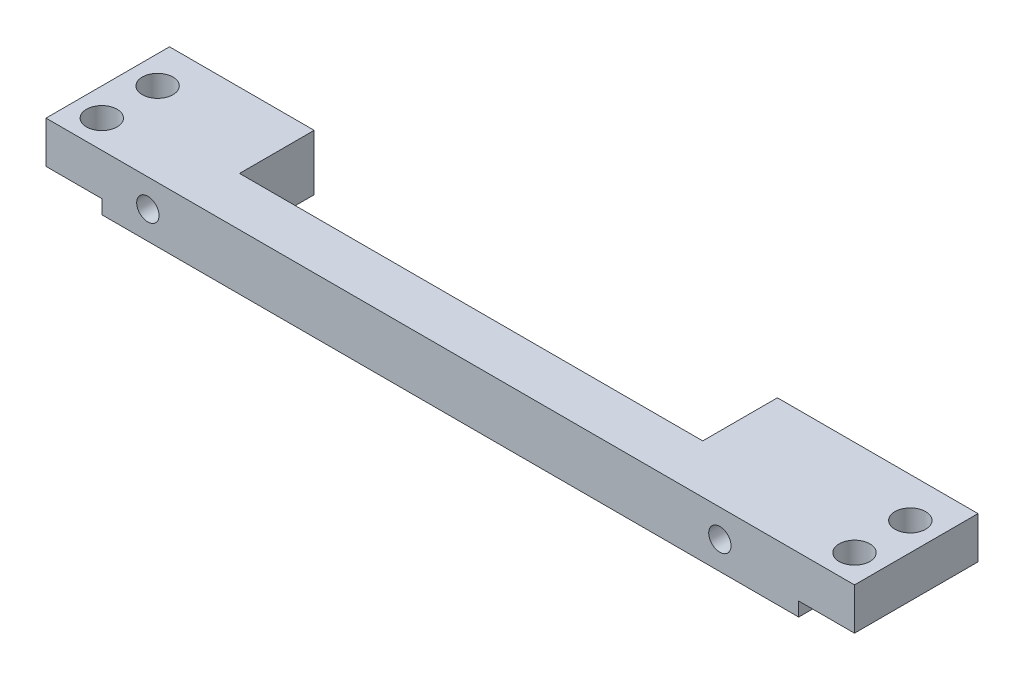
ISO-10303-21;
HEADER;
FILE_DESCRIPTION(('STEP AP214'),'2;1');
FILE_NAME('part.step','',(''),(''),'','','');
FILE_SCHEMA(('AUTOMOTIVE_DESIGN { 1 0 10303 214 1 1 1 1 }'));
ENDSEC;
DATA;
#1=APPLICATION_CONTEXT('core data for automotive mechanical design processes');
#2=APPLICATION_PROTOCOL_DEFINITION('international standard','automotive_design',2000,#1);
#3=PRODUCT_CONTEXT('',#1,'mechanical');
#4=PRODUCT('Part','Part','',(#3));
#5=PRODUCT_RELATED_PRODUCT_CATEGORY('part','',(#4));
#6=PRODUCT_DEFINITION_FORMATION('','',#4);
#7=PRODUCT_DEFINITION_CONTEXT('part definition',#1,'design');
#8=PRODUCT_DEFINITION('design','',#6,#7);
#9=PRODUCT_DEFINITION_SHAPE('','',#8);
#10=(LENGTH_UNIT() NAMED_UNIT(*) SI_UNIT(.MILLI.,.METRE.));
#11=(NAMED_UNIT(*) PLANE_ANGLE_UNIT() SI_UNIT($,.RADIAN.));
#12=(NAMED_UNIT(*) SI_UNIT($,.STERADIAN.) SOLID_ANGLE_UNIT());
#13=UNCERTAINTY_MEASURE_WITH_UNIT(LENGTH_MEASURE(1.E-05),#10,'distance_accuracy_value','');
#14=(GEOMETRIC_REPRESENTATION_CONTEXT(3) GLOBAL_UNCERTAINTY_ASSIGNED_CONTEXT((#13)) GLOBAL_UNIT_ASSIGNED_CONTEXT((#10,
#11,#12)) REPRESENTATION_CONTEXT('',''));
#15=CARTESIAN_POINT('',(0.,0.,0.));
#16=DIRECTION('',(0.,0.,1.));
#17=DIRECTION('',(1.,0.,0.));
#18=AXIS2_PLACEMENT_3D('',#15,#16,#17);
#19=CARTESIAN_POINT('',(0.,0.,2.248090434488));
#20=DIRECTION('',(0.,0.,-1.));
#21=DIRECTION('',(-1.,0.,0.));
#22=AXIS2_PLACEMENT_3D('',#19,#20,#21);
#23=PLANE('',#22);
#24=DIRECTION('',(0.,1.,0.));
#25=VECTOR('',#24,1.);
#26=CARTESIAN_POINT('',(6.07,0.,2.248090434488));
#27=LINE('',#26,#25);
#28=CARTESIAN_POINT('',(6.07,41.68,2.248090434488));
#29=VERTEX_POINT('',#28);
#30=CARTESIAN_POINT('',(6.07,45.68,2.248090434488));
#31=VERTEX_POINT('',#30);
#32=EDGE_CURVE('E11',#29,#31,#27,.T.);
#33=ORIENTED_EDGE('',*,*,#32,.F.);
#34=DIRECTION('',(1.,0.,0.));
#35=VECTOR('',#34,1.);
#36=CARTESIAN_POINT('',(-4.3,41.68,2.248090434488));
#37=LINE('',#36,#35);
#38=CARTESIAN_POINT('',(-0.3,41.68,2.248090434488));
#39=VERTEX_POINT('',#38);
#40=EDGE_CURVE('E165',#39,#29,#37,.T.);
#41=ORIENTED_EDGE('',*,*,#40,.F.);
#42=DIRECTION('',(0.,1.,0.));
#43=VECTOR('',#42,1.);
#44=CARTESIAN_POINT('',(-0.3,41.68,2.248090434488));
#45=LINE('',#44,#43);
#46=CARTESIAN_POINT('',(-0.3,42.68,2.248090434488));
#47=VERTEX_POINT('',#46);
#48=EDGE_CURVE('E223',#39,#47,#45,.T.);
#49=ORIENTED_EDGE('',*,*,#48,.T.);
#50=DIRECTION('',(-1.,0.,0.));
#51=VECTOR('',#50,1.);
#52=CARTESIAN_POINT('',(-4.3,42.68,2.248090434488));
#53=LINE('',#52,#51);
#54=CARTESIAN_POINT('',(-4.3,42.68,2.248090434488));
#55=VERTEX_POINT('',#54);
#56=EDGE_CURVE('E227',#47,#55,#53,.T.);
#57=ORIENTED_EDGE('',*,*,#56,.T.);
#58=DIRECTION('',(0.,-1.,0.));
#59=VECTOR('',#58,1.);
#60=CARTESIAN_POINT('',(-4.3,41.68,2.248090434488));
#61=LINE('',#60,#59);
#62=CARTESIAN_POINT('',(-4.3,45.68,2.248090434488));
#63=VERTEX_POINT('',#62);
#64=EDGE_CURVE('E242',#63,#55,#61,.T.);
#65=ORIENTED_EDGE('',*,*,#64,.F.);
#66=DIRECTION('',(-1.,0.,0.));
#67=VECTOR('',#66,1.);
#68=CARTESIAN_POINT('',(-4.3,45.68,2.248090434488));
#69=LINE('',#68,#67);
#70=EDGE_CURVE('E273',#31,#63,#69,.T.);
#71=ORIENTED_EDGE('',*,*,#70,.F.);
#72=EDGE_LOOP('',(#33,#41,#49,#57,#65,#71));
#73=FACE_BOUND('',#72,.T.);
#74=CARTESIAN_POINT('',(3.,43.68,2.248090434488));
#75=DIRECTION('',(0.,0.,1.));
#76=DIRECTION('',(1.,0.,0.));
#77=AXIS2_PLACEMENT_3D('',#74,#75,#76);
#78=CIRCLE('',#77,0.8);
#79=CARTESIAN_POINT('',(3.8,43.68,2.248090434488));
#80=VERTEX_POINT('',#79);
#81=EDGE_CURVE('E186',#80,#80,#78,.T.);
#82=ORIENTED_EDGE('',*,*,#81,.T.);
#83=EDGE_LOOP('',(#82));
#84=FACE_BOUND('',#83,.T.);
#85=ADVANCED_FACE('F47',(#73,#84),#23,.T.);
#86=CARTESIAN_POINT('',(-4.3,41.68,11.1));
#87=DIRECTION('',(1.,0.,0.));
#88=DIRECTION('',(0.,0.,-1.));
#89=AXIS2_PLACEMENT_3D('',#86,#87,#88);
#90=PLANE('',#89);
#91=ORIENTED_EDGE('',*,*,#64,.T.);
#92=DIRECTION('',(0.,0.,1.));
#93=VECTOR('',#92,1.);
#94=CARTESIAN_POINT('',(-4.3,42.68,2.248090434488));
#95=LINE('',#94,#93);
#96=CARTESIAN_POINT('',(-4.3,42.68,11.1));
#97=VERTEX_POINT('',#96);
#98=EDGE_CURVE('E238',#55,#97,#95,.T.);
#99=ORIENTED_EDGE('',*,*,#98,.T.);
#100=DIRECTION('',(0.,-1.,0.));
#101=VECTOR('',#100,1.);
#102=CARTESIAN_POINT('',(-4.3,41.68,11.1));
#103=LINE('',#102,#101);
#104=CARTESIAN_POINT('',(-4.3,45.68,11.1));
#105=VERTEX_POINT('',#104);
#106=EDGE_CURVE('E248',#105,#97,#103,.T.);
#107=ORIENTED_EDGE('',*,*,#106,.F.);
#108=DIRECTION('',(0.,0.,-1.));
#109=VECTOR('',#108,1.);
#110=CARTESIAN_POINT('',(-4.3,45.68,11.1));
#111=LINE('',#110,#109);
#112=EDGE_CURVE('E263',#105,#63,#111,.T.);
#113=ORIENTED_EDGE('',*,*,#112,.T.);
#114=EDGE_LOOP('',(#91,#99,#107,#113));
#115=FACE_BOUND('',#114,.T.);
#116=ADVANCED_FACE('F49',(#115),#90,.F.);
#117=CARTESIAN_POINT('',(-4.3,41.68,11.1));
#118=DIRECTION('',(0.,1.,0.));
#119=DIRECTION('',(0.,0.,1.));
#120=AXIS2_PLACEMENT_3D('',#117,#118,#119);
#121=PLANE('',#120);
#122=ORIENTED_EDGE('',*,*,#40,.T.);
#123=DIRECTION('',(0.,0.,1.));
#124=VECTOR('',#123,1.);
#125=CARTESIAN_POINT('',(6.07,41.68,0.9));
#126=LINE('',#125,#124);
#127=CARTESIAN_POINT('',(6.07,41.68,7.6));
#128=VERTEX_POINT('',#127);
#129=EDGE_CURVE('E142',#29,#128,#126,.T.);
#130=ORIENTED_EDGE('',*,*,#129,.T.);
#131=DIRECTION('',(1.,0.,0.));
#132=VECTOR('',#131,1.);
#133=CARTESIAN_POINT('',(6.07,41.68,7.6));
#134=LINE('',#133,#132);
#135=CARTESIAN_POINT('',(39.273,41.68,7.6));
#136=VERTEX_POINT('',#135);
#137=EDGE_CURVE('E154',#128,#136,#134,.T.);
#138=ORIENTED_EDGE('',*,*,#137,.T.);
#139=DIRECTION('',(0.,0.,-1.));
#140=VECTOR('',#139,1.);
#141=CARTESIAN_POINT('',(39.273,41.68,0.9));
#142=LINE('',#141,#140);
#143=CARTESIAN_POINT('',(39.273,41.68,2.248090434488));
#144=VERTEX_POINT('',#143);
#145=EDGE_CURVE('E151',#136,#144,#142,.T.);
#146=ORIENTED_EDGE('',*,*,#145,.T.);
#147=CARTESIAN_POINT('',(49.65,41.68,2.248090434488));
#148=VERTEX_POINT('',#147);
#149=EDGE_CURVE('E267',#144,#148,#37,.T.);
#150=ORIENTED_EDGE('',*,*,#149,.T.);
#151=DIRECTION('',(0.,0.,1.));
#152=VECTOR('',#151,1.);
#153=CARTESIAN_POINT('',(49.65,41.68,2.248090434488));
#154=LINE('',#153,#152);
#155=CARTESIAN_POINT('',(49.65,41.68,11.1));
#156=VERTEX_POINT('',#155);
#157=EDGE_CURVE('E209',#148,#156,#154,.T.);
#158=ORIENTED_EDGE('',*,*,#157,.T.);
#159=DIRECTION('',(1.,0.,0.));
#160=VECTOR('',#159,1.);
#161=CARTESIAN_POINT('',(-4.3,41.68,11.1));
#162=LINE('',#161,#160);
#163=CARTESIAN_POINT('',(-0.3,41.68,11.1));
#164=VERTEX_POINT('',#163);
#165=EDGE_CURVE('E252',#164,#156,#162,.T.);
#166=ORIENTED_EDGE('',*,*,#165,.F.);
#167=DIRECTION('',(0.,0.,1.));
#168=VECTOR('',#167,1.);
#169=CARTESIAN_POINT('',(-0.3,41.68,2.248090434488));
#170=LINE('',#169,#168);
#171=EDGE_CURVE('E232',#39,#164,#170,.T.);
#172=ORIENTED_EDGE('',*,*,#171,.F.);
#173=EDGE_LOOP('',(#122,#130,#138,#146,#150,#158,#166,#172));
#174=FACE_BOUND('',#173,.T.);
#175=ADVANCED_FACE('F162',(#174),#121,.F.);
#176=CARTESIAN_POINT('',(53.65,41.68,11.1));
#177=DIRECTION('',(-1.,0.,0.));
#178=DIRECTION('',(0.,0.,1.));
#179=AXIS2_PLACEMENT_3D('',#176,#177,#178);
#180=PLANE('',#179);
#181=DIRECTION('',(0.,1.,0.));
#182=VECTOR('',#181,1.);
#183=CARTESIAN_POINT('',(53.65,41.68,11.1));
#184=LINE('',#183,#182);
#185=CARTESIAN_POINT('',(53.65,42.68,11.1));
#186=VERTEX_POINT('',#185);
#187=CARTESIAN_POINT('',(53.65,45.68,11.1));
#188=VERTEX_POINT('',#187);
#189=EDGE_CURVE('E257',#186,#188,#184,.T.);
#190=ORIENTED_EDGE('',*,*,#189,.F.);
#191=DIRECTION('',(0.,0.,1.));
#192=VECTOR('',#191,1.);
#193=CARTESIAN_POINT('',(53.65,42.68,2.248090434488));
#194=LINE('',#193,#192);
#195=CARTESIAN_POINT('',(53.65,42.68,2.248090434488));
#196=VERTEX_POINT('',#195);
#197=EDGE_CURVE('E218',#196,#186,#194,.T.);
#198=ORIENTED_EDGE('',*,*,#197,.F.);
#199=DIRECTION('',(0.,1.,0.));
#200=VECTOR('',#199,1.);
#201=CARTESIAN_POINT('',(53.65,41.68,2.248090434488));
#202=LINE('',#201,#200);
#203=CARTESIAN_POINT('',(53.65,45.68,2.248090434488));
#204=VERTEX_POINT('',#203);
#205=EDGE_CURVE('E270',#196,#204,#202,.T.);
#206=ORIENTED_EDGE('',*,*,#205,.T.);
#207=DIRECTION('',(0.,0.,-1.));
#208=VECTOR('',#207,1.);
#209=CARTESIAN_POINT('',(53.65,45.68,11.1));
#210=LINE('',#209,#208);
#211=EDGE_CURVE('E280',#188,#204,#210,.T.);
#212=ORIENTED_EDGE('',*,*,#211,.F.);
#213=EDGE_LOOP('',(#190,#198,#206,#212));
#214=FACE_BOUND('',#213,.T.);
#215=ADVANCED_FACE('F365',(#214),#180,.F.);
#216=CARTESIAN_POINT('',(-4.3,45.68,11.1));
#217=DIRECTION('',(0.,-1.,0.));
#218=DIRECTION('',(0.,0.,-1.));
#219=AXIS2_PLACEMENT_3D('',#216,#217,#218);
#220=PLANE('',#219);
#221=CARTESIAN_POINT('',(-2.3,45.68,9.1));
#222=DIRECTION('',(0.,1.,0.));
#223=DIRECTION('',(0.,0.,1.));
#224=AXIS2_PLACEMENT_3D('',#221,#222,#223);
#225=CIRCLE('',#224,1.1);
#226=CARTESIAN_POINT('',(-2.3,45.68,10.2));
#227=VERTEX_POINT('',#226);
#228=EDGE_CURVE('E410',#227,#227,#225,.T.);
#229=ORIENTED_EDGE('',*,*,#228,.F.);
#230=EDGE_LOOP('',(#229));
#231=FACE_BOUND('',#230,.T.);
#232=CARTESIAN_POINT('',(51.65,45.68,5.1));
#233=DIRECTION('',(0.,1.,0.));
#234=DIRECTION('',(0.,0.,1.));
#235=AXIS2_PLACEMENT_3D('',#232,#233,#234);
#236=CIRCLE('',#235,1.1);
#237=CARTESIAN_POINT('',(51.65,45.68,6.2));
#238=VERTEX_POINT('',#237);
#239=EDGE_CURVE('E403',#238,#238,#236,.T.);
#240=ORIENTED_EDGE('',*,*,#239,.F.);
#241=EDGE_LOOP('',(#240));
#242=FACE_BOUND('',#241,.T.);
#243=CARTESIAN_POINT('',(51.65,45.68,9.1));
#244=DIRECTION('',(0.,1.,0.));
#245=DIRECTION('',(0.,0.,1.));
#246=AXIS2_PLACEMENT_3D('',#243,#244,#245);
#247=CIRCLE('',#246,1.1);
#248=CARTESIAN_POINT('',(51.65,45.68,10.2));
#249=VERTEX_POINT('',#248);
#250=EDGE_CURVE('E411',#249,#249,#247,.T.);
#251=ORIENTED_EDGE('',*,*,#250,.F.);
#252=EDGE_LOOP('',(#251));
#253=FACE_BOUND('',#252,.T.);
#254=CARTESIAN_POINT('',(-2.3,45.68,5.1));
#255=DIRECTION('',(0.,1.,0.));
#256=DIRECTION('',(0.,0.,1.));
#257=AXIS2_PLACEMENT_3D('',#254,#255,#256);
#258=CIRCLE('',#257,1.1);
#259=CARTESIAN_POINT('',(-2.3,45.68,6.2));
#260=VERTEX_POINT('',#259);
#261=EDGE_CURVE('E174',#260,#260,#258,.T.);
#262=ORIENTED_EDGE('',*,*,#261,.F.);
#263=EDGE_LOOP('',(#262));
#264=FACE_BOUND('',#263,.T.);
#265=DIRECTION('',(1.,0.,0.));
#266=VECTOR('',#265,1.);
#267=CARTESIAN_POINT('',(6.07,45.68,7.6));
#268=LINE('',#267,#266);
#269=CARTESIAN_POINT('',(6.07,45.68,7.6));
#270=VERTEX_POINT('',#269);
#271=CARTESIAN_POINT('',(39.273,45.68,7.6));
#272=VERTEX_POINT('',#271);
#273=EDGE_CURVE('E171',#270,#272,#268,.T.);
#274=ORIENTED_EDGE('',*,*,#273,.F.);
#275=DIRECTION('',(0.,0.,1.));
#276=VECTOR('',#275,1.);
#277=CARTESIAN_POINT('',(6.07,45.68,0.9));
#278=LINE('',#277,#276);
#279=EDGE_CURVE('E145',#31,#270,#278,.T.);
#280=ORIENTED_EDGE('',*,*,#279,.F.);
#281=ORIENTED_EDGE('',*,*,#70,.T.);
#282=ORIENTED_EDGE('',*,*,#112,.F.);
#283=DIRECTION('',(-1.,0.,0.));
#284=VECTOR('',#283,1.);
#285=CARTESIAN_POINT('',(-4.3,45.68,11.1));
#286=LINE('',#285,#284);
#287=EDGE_CURVE('E260',#188,#105,#286,.T.);
#288=ORIENTED_EDGE('',*,*,#287,.F.);
#289=ORIENTED_EDGE('',*,*,#211,.T.);
#290=CARTESIAN_POINT('',(39.273,45.68,2.248090434488));
#291=VERTEX_POINT('',#290);
#292=EDGE_CURVE('E253',#204,#291,#69,.T.);
#293=ORIENTED_EDGE('',*,*,#292,.T.);
#294=DIRECTION('',(0.,0.,-1.));
#295=VECTOR('',#294,1.);
#296=CARTESIAN_POINT('',(39.273,45.68,0.9));
#297=LINE('',#296,#295);
#298=EDGE_CURVE('E65',#272,#291,#297,.T.);
#299=ORIENTED_EDGE('',*,*,#298,.F.);
#300=EDGE_LOOP('',(#274,#280,#281,#282,#288,#289,#293,#299));
#301=FACE_BOUND('',#300,.T.);
#302=ADVANCED_FACE('F338',(#231,#242,#253,#264,#301),#220,.F.);
#303=CARTESIAN_POINT('',(0.,0.,11.1));
#304=DIRECTION('',(0.,0.,-1.));
#305=DIRECTION('',(-1.,0.,0.));
#306=AXIS2_PLACEMENT_3D('',#303,#304,#305);
#307=PLANE('',#306);
#308=CARTESIAN_POINT('',(3.,43.68,11.1));
#309=DIRECTION('',(0.,0.,1.));
#310=DIRECTION('',(1.,0.,0.));
#311=AXIS2_PLACEMENT_3D('',#308,#309,#310);
#312=CIRCLE('',#311,0.8);
#313=CARTESIAN_POINT('',(3.8,43.68,11.1));
#314=VERTEX_POINT('',#313);
#315=EDGE_CURVE('E191',#314,#314,#312,.T.);
#316=ORIENTED_EDGE('',*,*,#315,.F.);
#317=EDGE_LOOP('',(#316));
#318=FACE_BOUND('',#317,.T.);
#319=CARTESIAN_POINT('',(44.,43.68,11.1));
#320=DIRECTION('',(0.,0.,1.));
#321=DIRECTION('',(1.,0.,0.));
#322=AXIS2_PLACEMENT_3D('',#319,#320,#321);
#323=CIRCLE('',#322,0.800000000000002);
#324=CARTESIAN_POINT('',(44.8,43.68,11.1));
#325=VERTEX_POINT('',#324);
#326=EDGE_CURVE('E195',#325,#325,#323,.T.);
#327=ORIENTED_EDGE('',*,*,#326,.F.);
#328=EDGE_LOOP('',(#327));
#329=FACE_BOUND('',#328,.T.);
#330=ORIENTED_EDGE('',*,*,#165,.T.);
#331=DIRECTION('',(0.,-1.,0.));
#332=VECTOR('',#331,1.);
#333=CARTESIAN_POINT('',(49.65,41.68,11.1));
#334=LINE('',#333,#332);
#335=CARTESIAN_POINT('',(49.65,42.68,11.1));
#336=VERTEX_POINT('',#335);
#337=EDGE_CURVE('E190',#336,#156,#334,.T.);
#338=ORIENTED_EDGE('',*,*,#337,.F.);
#339=DIRECTION('',(-1.,0.,0.));
#340=VECTOR('',#339,1.);
#341=CARTESIAN_POINT('',(49.65,42.68,11.1));
#342=LINE('',#341,#340);
#343=EDGE_CURVE('E205',#186,#336,#342,.T.);
#344=ORIENTED_EDGE('',*,*,#343,.F.);
#345=ORIENTED_EDGE('',*,*,#189,.T.);
#346=ORIENTED_EDGE('',*,*,#287,.T.);
#347=ORIENTED_EDGE('',*,*,#106,.T.);
#348=DIRECTION('',(-1.,0.,0.));
#349=VECTOR('',#348,1.);
#350=CARTESIAN_POINT('',(-4.3,42.68,11.1));
#351=LINE('',#350,#349);
#352=CARTESIAN_POINT('',(-0.3,42.68,11.1));
#353=VERTEX_POINT('',#352);
#354=EDGE_CURVE('E228',#353,#97,#351,.T.);
#355=ORIENTED_EDGE('',*,*,#354,.F.);
#356=DIRECTION('',(0.,1.,0.));
#357=VECTOR('',#356,1.);
#358=CARTESIAN_POINT('',(-0.3,41.68,11.1));
#359=LINE('',#358,#357);
#360=EDGE_CURVE('E217',#164,#353,#359,.T.);
#361=ORIENTED_EDGE('',*,*,#360,.F.);
#362=EDGE_LOOP('',(#330,#338,#344,#345,#346,#347,#355,#361));
#363=FACE_BOUND('',#362,.T.);
#364=ADVANCED_FACE('F331',(#318,#329,#363),#307,.F.);
#365=DIRECTION('',(0.,-1.,0.));
#366=VECTOR('',#365,1.);
#367=CARTESIAN_POINT('',(39.273,0.,2.248090434488));
#368=LINE('',#367,#366);
#369=EDGE_CURVE('E57',#291,#144,#368,.T.);
#370=ORIENTED_EDGE('',*,*,#369,.F.);
#371=ORIENTED_EDGE('',*,*,#292,.F.);
#372=ORIENTED_EDGE('',*,*,#205,.F.);
#373=DIRECTION('',(-1.,0.,0.));
#374=VECTOR('',#373,1.);
#375=CARTESIAN_POINT('',(49.65,42.68,2.248090434488));
#376=LINE('',#375,#374);
#377=CARTESIAN_POINT('',(49.65,42.68,2.248090434488));
#378=VERTEX_POINT('',#377);
#379=EDGE_CURVE('E204',#196,#378,#376,.T.);
#380=ORIENTED_EDGE('',*,*,#379,.T.);
#381=DIRECTION('',(0.,-1.,0.));
#382=VECTOR('',#381,1.);
#383=CARTESIAN_POINT('',(49.65,41.68,2.248090434488));
#384=LINE('',#383,#382);
#385=EDGE_CURVE('E73',#378,#148,#384,.T.);
#386=ORIENTED_EDGE('',*,*,#385,.T.);
#387=ORIENTED_EDGE('',*,*,#149,.F.);
#388=EDGE_LOOP('',(#370,#371,#372,#380,#386,#387));
#389=FACE_BOUND('',#388,.T.);
#390=CARTESIAN_POINT('',(44.,43.68,2.248090434488));
#391=DIRECTION('',(0.,0.,1.));
#392=DIRECTION('',(1.,0.,0.));
#393=AXIS2_PLACEMENT_3D('',#390,#391,#392);
#394=CIRCLE('',#393,0.800000000000002);
#395=CARTESIAN_POINT('',(44.8,43.68,2.248090434488));
#396=VERTEX_POINT('',#395);
#397=EDGE_CURVE('E184',#396,#396,#394,.T.);
#398=ORIENTED_EDGE('',*,*,#397,.T.);
#399=EDGE_LOOP('',(#398));
#400=FACE_BOUND('',#399,.T.);
#401=ADVANCED_FACE('F323',(#389,#400),#23,.T.);
#402=CARTESIAN_POINT('',(-4.3,42.68,2.248090434488));
#403=DIRECTION('',(0.,1.,0.));
#404=DIRECTION('',(0.,0.,1.));
#405=AXIS2_PLACEMENT_3D('',#402,#403,#404);
#406=PLANE('',#405);
#407=CARTESIAN_POINT('',(-2.3,42.68,9.1));
#408=DIRECTION('',(0.,1.,0.));
#409=DIRECTION('',(0.,0.,1.));
#410=AXIS2_PLACEMENT_3D('',#407,#408,#409);
#411=CIRCLE('',#410,1.1);
#412=CARTESIAN_POINT('',(-2.3,42.68,10.2));
#413=VERTEX_POINT('',#412);
#414=EDGE_CURVE('E51',#413,#413,#411,.T.);
#415=ORIENTED_EDGE('',*,*,#414,.T.);
#416=EDGE_LOOP('',(#415));
#417=FACE_BOUND('',#416,.T.);
#418=CARTESIAN_POINT('',(-2.3,42.68,5.1));
#419=DIRECTION('',(0.,1.,0.));
#420=DIRECTION('',(0.,0.,1.));
#421=AXIS2_PLACEMENT_3D('',#418,#419,#420);
#422=CIRCLE('',#421,1.1);
#423=CARTESIAN_POINT('',(-2.3,42.68,6.2));
#424=VERTEX_POINT('',#423);
#425=EDGE_CURVE('E293',#424,#424,#422,.T.);
#426=ORIENTED_EDGE('',*,*,#425,.T.);
#427=EDGE_LOOP('',(#426));
#428=FACE_BOUND('',#427,.T.);
#429=ORIENTED_EDGE('',*,*,#354,.T.);
#430=ORIENTED_EDGE('',*,*,#98,.F.);
#431=ORIENTED_EDGE('',*,*,#56,.F.);
#432=DIRECTION('',(0.,0.,1.));
#433=VECTOR('',#432,1.);
#434=CARTESIAN_POINT('',(-0.3,42.68,2.248090434488));
#435=LINE('',#434,#433);
#436=EDGE_CURVE('E243',#47,#353,#435,.T.);
#437=ORIENTED_EDGE('',*,*,#436,.T.);
#438=EDGE_LOOP('',(#429,#430,#431,#437));
#439=FACE_BOUND('',#438,.T.);
#440=ADVANCED_FACE('F305',(#417,#428,#439),#406,.F.);
#441=CARTESIAN_POINT('',(-0.3,41.68,2.248090434488));
#442=DIRECTION('',(1.,0.,0.));
#443=DIRECTION('',(0.,0.,-1.));
#444=AXIS2_PLACEMENT_3D('',#441,#442,#443);
#445=PLANE('',#444);
#446=ORIENTED_EDGE('',*,*,#360,.T.);
#447=ORIENTED_EDGE('',*,*,#436,.F.);
#448=ORIENTED_EDGE('',*,*,#48,.F.);
#449=ORIENTED_EDGE('',*,*,#171,.T.);
#450=EDGE_LOOP('',(#446,#447,#448,#449));
#451=FACE_BOUND('',#450,.T.);
#452=ADVANCED_FACE('F336',(#451),#445,.F.);
#453=CARTESIAN_POINT('',(49.65,41.68,2.248090434488));
#454=DIRECTION('',(-1.,0.,0.));
#455=DIRECTION('',(0.,0.,1.));
#456=AXIS2_PLACEMENT_3D('',#453,#454,#455);
#457=PLANE('',#456);
#458=ORIENTED_EDGE('',*,*,#337,.T.);
#459=ORIENTED_EDGE('',*,*,#157,.F.);
#460=ORIENTED_EDGE('',*,*,#385,.F.);
#461=DIRECTION('',(0.,0.,1.));
#462=VECTOR('',#461,1.);
#463=CARTESIAN_POINT('',(49.65,42.68,2.248090434488));
#464=LINE('',#463,#462);
#465=EDGE_CURVE('E214',#378,#336,#464,.T.);
#466=ORIENTED_EDGE('',*,*,#465,.T.);
#467=EDGE_LOOP('',(#458,#459,#460,#466));
#468=FACE_BOUND('',#467,.T.);
#469=ADVANCED_FACE('F359',(#468),#457,.F.);
#470=CARTESIAN_POINT('',(49.65,42.68,2.248090434488));
#471=DIRECTION('',(0.,1.,0.));
#472=DIRECTION('',(0.,0.,1.));
#473=AXIS2_PLACEMENT_3D('',#470,#471,#472);
#474=PLANE('',#473);
#475=CARTESIAN_POINT('',(51.65,42.68,5.1));
#476=DIRECTION('',(0.,1.,0.));
#477=DIRECTION('',(0.,0.,1.));
#478=AXIS2_PLACEMENT_3D('',#475,#476,#477);
#479=CIRCLE('',#478,1.1);
#480=CARTESIAN_POINT('',(51.65,42.68,6.2));
#481=VERTEX_POINT('',#480);
#482=EDGE_CURVE('E290',#481,#481,#479,.T.);
#483=ORIENTED_EDGE('',*,*,#482,.T.);
#484=EDGE_LOOP('',(#483));
#485=FACE_BOUND('',#484,.T.);
#486=CARTESIAN_POINT('',(51.65,42.68,9.1));
#487=DIRECTION('',(0.,1.,0.));
#488=DIRECTION('',(0.,0.,1.));
#489=AXIS2_PLACEMENT_3D('',#486,#487,#488);
#490=CIRCLE('',#489,1.1);
#491=CARTESIAN_POINT('',(51.65,42.68,10.2));
#492=VERTEX_POINT('',#491);
#493=EDGE_CURVE('E286',#492,#492,#490,.T.);
#494=ORIENTED_EDGE('',*,*,#493,.T.);
#495=EDGE_LOOP('',(#494));
#496=FACE_BOUND('',#495,.T.);
#497=ORIENTED_EDGE('',*,*,#343,.T.);
#498=ORIENTED_EDGE('',*,*,#465,.F.);
#499=ORIENTED_EDGE('',*,*,#379,.F.);
#500=ORIENTED_EDGE('',*,*,#197,.T.);
#501=EDGE_LOOP('',(#497,#498,#499,#500));
#502=FACE_BOUND('',#501,.T.);
#503=ADVANCED_FACE('F349',(#485,#496,#502),#474,.F.);
#504=CARTESIAN_POINT('',(44.,43.68,2.248090434488));
#505=DIRECTION('',(0.,0.,1.));
#506=DIRECTION('',(1.,0.,0.));
#507=AXIS2_PLACEMENT_3D('',#504,#505,#506);
#508=CYLINDRICAL_SURFACE('',#507,0.800000000000002);
#509=ORIENTED_EDGE('',*,*,#397,.F.);
#510=EDGE_LOOP('',(#509));
#511=FACE_BOUND('',#510,.T.);
#512=ORIENTED_EDGE('',*,*,#326,.T.);
#513=EDGE_LOOP('',(#512));
#514=FACE_BOUND('',#513,.T.);
#515=ADVANCED_FACE('F345',(#511,#514),#508,.F.);
#516=CARTESIAN_POINT('',(3.,43.68,2.248090434488));
#517=DIRECTION('',(0.,0.,1.));
#518=DIRECTION('',(1.,0.,0.));
#519=AXIS2_PLACEMENT_3D('',#516,#517,#518);
#520=CYLINDRICAL_SURFACE('',#519,0.8);
#521=ORIENTED_EDGE('',*,*,#81,.F.);
#522=EDGE_LOOP('',(#521));
#523=FACE_BOUND('',#522,.T.);
#524=ORIENTED_EDGE('',*,*,#315,.T.);
#525=EDGE_LOOP('',(#524));
#526=FACE_BOUND('',#525,.T.);
#527=ADVANCED_FACE('F348',(#523,#526),#520,.F.);
#528=CARTESIAN_POINT('',(6.07,41.68,0.9));
#529=DIRECTION('',(-1.,0.,0.));
#530=DIRECTION('',(0.,0.,1.));
#531=AXIS2_PLACEMENT_3D('',#528,#529,#530);
#532=PLANE('',#531);
#533=ORIENTED_EDGE('',*,*,#32,.T.);
#534=ORIENTED_EDGE('',*,*,#279,.T.);
#535=DIRECTION('',(0.,1.,0.));
#536=VECTOR('',#535,1.);
#537=CARTESIAN_POINT('',(6.07,41.68,7.6));
#538=LINE('',#537,#536);
#539=EDGE_CURVE('E138',#128,#270,#538,.T.);
#540=ORIENTED_EDGE('',*,*,#539,.F.);
#541=ORIENTED_EDGE('',*,*,#129,.F.);
#542=EDGE_LOOP('',(#533,#534,#540,#541));
#543=FACE_BOUND('',#542,.T.);
#544=ADVANCED_FACE('F140',(#543),#532,.F.);
#545=CARTESIAN_POINT('',(39.273,41.68,0.9));
#546=DIRECTION('',(1.,0.,0.));
#547=DIRECTION('',(0.,0.,-1.));
#548=AXIS2_PLACEMENT_3D('',#545,#546,#547);
#549=PLANE('',#548);
#550=ORIENTED_EDGE('',*,*,#369,.T.);
#551=ORIENTED_EDGE('',*,*,#145,.F.);
#552=DIRECTION('',(0.,1.,0.));
#553=VECTOR('',#552,1.);
#554=CARTESIAN_POINT('',(39.273,41.68,7.6));
#555=LINE('',#554,#553);
#556=EDGE_CURVE('E150',#136,#272,#555,.T.);
#557=ORIENTED_EDGE('',*,*,#556,.T.);
#558=ORIENTED_EDGE('',*,*,#298,.T.);
#559=EDGE_LOOP('',(#550,#551,#557,#558));
#560=FACE_BOUND('',#559,.T.);
#561=ADVANCED_FACE('F390',(#560),#549,.F.);
#562=CARTESIAN_POINT('',(6.07,41.68,7.6));
#563=DIRECTION('',(0.,0.,1.));
#564=DIRECTION('',(1.,0.,0.));
#565=AXIS2_PLACEMENT_3D('',#562,#563,#564);
#566=PLANE('',#565);
#567=ORIENTED_EDGE('',*,*,#273,.T.);
#568=ORIENTED_EDGE('',*,*,#556,.F.);
#569=ORIENTED_EDGE('',*,*,#137,.F.);
#570=ORIENTED_EDGE('',*,*,#539,.T.);
#571=EDGE_LOOP('',(#567,#568,#569,#570));
#572=FACE_BOUND('',#571,.T.);
#573=ADVANCED_FACE('F155',(#572),#566,.F.);
#574=CARTESIAN_POINT('',(51.65,41.68,9.1));
#575=DIRECTION('',(0.,1.,0.));
#576=DIRECTION('',(0.,0.,1.));
#577=AXIS2_PLACEMENT_3D('',#574,#575,#576);
#578=CYLINDRICAL_SURFACE('',#577,1.1);
#579=ORIENTED_EDGE('',*,*,#250,.T.);
#580=EDGE_LOOP('',(#579));
#581=FACE_BOUND('',#580,.T.);
#582=ORIENTED_EDGE('',*,*,#493,.F.);
#583=EDGE_LOOP('',(#582));
#584=FACE_BOUND('',#583,.T.);
#585=ADVANCED_FACE('F393',(#581,#584),#578,.F.);
#586=CARTESIAN_POINT('',(51.65,41.68,5.1));
#587=DIRECTION('',(0.,1.,0.));
#588=DIRECTION('',(0.,0.,1.));
#589=AXIS2_PLACEMENT_3D('',#586,#587,#588);
#590=CYLINDRICAL_SURFACE('',#589,1.1);
#591=ORIENTED_EDGE('',*,*,#239,.T.);
#592=EDGE_LOOP('',(#591));
#593=FACE_BOUND('',#592,.T.);
#594=ORIENTED_EDGE('',*,*,#482,.F.);
#595=EDGE_LOOP('',(#594));
#596=FACE_BOUND('',#595,.T.);
#597=ADVANCED_FACE('F314',(#593,#596),#590,.F.);
#598=CARTESIAN_POINT('',(-2.3,41.68,5.1));
#599=DIRECTION('',(0.,1.,0.));
#600=DIRECTION('',(0.,0.,1.));
#601=AXIS2_PLACEMENT_3D('',#598,#599,#600);
#602=CYLINDRICAL_SURFACE('',#601,1.1);
#603=ORIENTED_EDGE('',*,*,#261,.T.);
#604=EDGE_LOOP('',(#603));
#605=FACE_BOUND('',#604,.T.);
#606=ORIENTED_EDGE('',*,*,#425,.F.);
#607=EDGE_LOOP('',(#606));
#608=FACE_BOUND('',#607,.T.);
#609=ADVANCED_FACE('F309',(#605,#608),#602,.F.);
#610=CARTESIAN_POINT('',(-2.3,41.68,9.1));
#611=DIRECTION('',(0.,1.,0.));
#612=DIRECTION('',(0.,0.,1.));
#613=AXIS2_PLACEMENT_3D('',#610,#611,#612);
#614=CYLINDRICAL_SURFACE('',#613,1.1);
#615=ORIENTED_EDGE('',*,*,#228,.T.);
#616=EDGE_LOOP('',(#615));
#617=FACE_BOUND('',#616,.T.);
#618=ORIENTED_EDGE('',*,*,#414,.F.);
#619=EDGE_LOOP('',(#618));
#620=FACE_BOUND('',#619,.T.);
#621=ADVANCED_FACE('F307',(#617,#620),#614,.F.);
#622=CLOSED_SHELL('',(#85,#116,#175,#215,#302,#364,#401,#440,#452,#469,#503,#515,#527,#544,#561,
#573,#585,#597,#609,#621));
#623=MANIFOLD_SOLID_BREP('B2',#622);
#624=ADVANCED_BREP_SHAPE_REPRESENTATION('',(#18,#623),#14);
#625=SHAPE_DEFINITION_REPRESENTATION(#9,#624);
ENDSEC;
END-ISO-10303-21;
